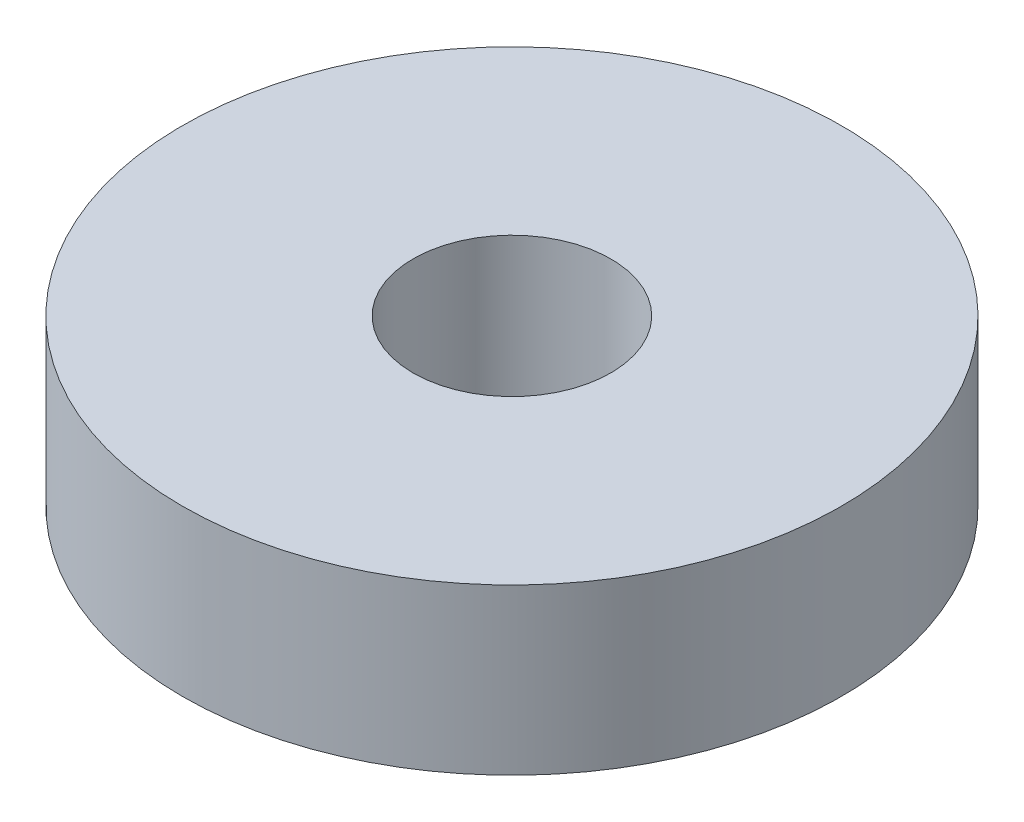
ISO-10303-21;
HEADER;
FILE_DESCRIPTION(('STEP AP214'),'2;1');
FILE_NAME('part.step','',(''),(''),'','','');
FILE_SCHEMA(('AUTOMOTIVE_DESIGN { 1 0 10303 214 1 1 1 1 }'));
ENDSEC;
DATA;
#1=APPLICATION_CONTEXT('core data for automotive mechanical design processes');
#2=APPLICATION_PROTOCOL_DEFINITION('international standard','automotive_design',2000,#1);
#3=PRODUCT_CONTEXT('',#1,'mechanical');
#4=PRODUCT('Part','Part','',(#3));
#5=PRODUCT_RELATED_PRODUCT_CATEGORY('part','',(#4));
#6=PRODUCT_DEFINITION_FORMATION('','',#4);
#7=PRODUCT_DEFINITION_CONTEXT('part definition',#1,'design');
#8=PRODUCT_DEFINITION('design','',#6,#7);
#9=PRODUCT_DEFINITION_SHAPE('','',#8);
#10=(LENGTH_UNIT() NAMED_UNIT(*) SI_UNIT(.MILLI.,.METRE.));
#11=(NAMED_UNIT(*) PLANE_ANGLE_UNIT() SI_UNIT($,.RADIAN.));
#12=(NAMED_UNIT(*) SI_UNIT($,.STERADIAN.) SOLID_ANGLE_UNIT());
#13=UNCERTAINTY_MEASURE_WITH_UNIT(LENGTH_MEASURE(1.E-05),#10,'distance_accuracy_value','');
#14=(GEOMETRIC_REPRESENTATION_CONTEXT(3) GLOBAL_UNCERTAINTY_ASSIGNED_CONTEXT((#13)) GLOBAL_UNIT_ASSIGNED_CONTEXT((#10,
#11,#12)) REPRESENTATION_CONTEXT('',''));
#15=CARTESIAN_POINT('',(0.,0.,0.));
#16=DIRECTION('',(0.,0.,1.));
#17=DIRECTION('',(1.,0.,0.));
#18=AXIS2_PLACEMENT_3D('',#15,#16,#17);
#19=CARTESIAN_POINT('',(0.,5.,0.));
#20=DIRECTION('',(0.,-1.,0.));
#21=DIRECTION('',(0.,0.,-1.));
#22=AXIS2_PLACEMENT_3D('',#19,#20,#21);
#23=CYLINDRICAL_SURFACE('',#22,10.);
#24=CARTESIAN_POINT('',(0.,5.,0.));
#25=DIRECTION('',(0.,1.,0.));
#26=DIRECTION('',(0.,0.,1.));
#27=AXIS2_PLACEMENT_3D('',#24,#25,#26);
#28=CIRCLE('',#27,10.);
#29=CARTESIAN_POINT('',(0.,5.,10.));
#30=VERTEX_POINT('',#29);
#31=EDGE_CURVE('E10',#30,#30,#28,.T.);
#32=ORIENTED_EDGE('',*,*,#31,.F.);
#33=EDGE_LOOP('',(#32));
#34=FACE_BOUND('',#33,.T.);
#35=CARTESIAN_POINT('',(0.,0.,0.));
#36=DIRECTION('',(0.,1.,0.));
#37=DIRECTION('',(0.,0.,1.));
#38=AXIS2_PLACEMENT_3D('',#35,#36,#37);
#39=CIRCLE('',#38,10.);
#40=CARTESIAN_POINT('',(0.,0.,10.));
#41=VERTEX_POINT('',#40);
#42=EDGE_CURVE('E34',#41,#41,#39,.T.);
#43=ORIENTED_EDGE('',*,*,#42,.T.);
#44=EDGE_LOOP('',(#43));
#45=FACE_BOUND('',#44,.T.);
#46=ADVANCED_FACE('F31',(#34,#45),#23,.T.);
#47=CARTESIAN_POINT('',(0.,5.,0.));
#48=DIRECTION('',(0.,1.,0.));
#49=DIRECTION('',(0.,0.,1.));
#50=AXIS2_PLACEMENT_3D('',#47,#48,#49);
#51=PLANE('',#50);
#52=CARTESIAN_POINT('',(0.,5.,0.));
#53=DIRECTION('',(0.,1.,0.));
#54=DIRECTION('',(0.,0.,1.));
#55=AXIS2_PLACEMENT_3D('',#52,#53,#54);
#56=CIRCLE('',#55,3.);
#57=CARTESIAN_POINT('',(0.,5.,3.));
#58=VERTEX_POINT('',#57);
#59=EDGE_CURVE('E43',#58,#58,#56,.T.);
#60=ORIENTED_EDGE('',*,*,#59,.F.);
#61=EDGE_LOOP('',(#60));
#62=FACE_BOUND('',#61,.T.);
#63=ORIENTED_EDGE('',*,*,#31,.T.);
#64=EDGE_LOOP('',(#63));
#65=FACE_BOUND('',#64,.T.);
#66=ADVANCED_FACE('F58',(#62,#65),#51,.T.);
#67=CARTESIAN_POINT('',(0.,0.,0.));
#68=DIRECTION('',(0.,1.,0.));
#69=DIRECTION('',(0.,0.,1.));
#70=AXIS2_PLACEMENT_3D('',#67,#68,#69);
#71=PLANE('',#70);
#72=CARTESIAN_POINT('',(0.,0.,0.));
#73=DIRECTION('',(0.,1.,0.));
#74=DIRECTION('',(0.,0.,1.));
#75=AXIS2_PLACEMENT_3D('',#72,#73,#74);
#76=CIRCLE('',#75,3.);
#77=CARTESIAN_POINT('',(0.,0.,3.));
#78=VERTEX_POINT('',#77);
#79=EDGE_CURVE('E41',#78,#78,#76,.T.);
#80=ORIENTED_EDGE('',*,*,#79,.T.);
#81=EDGE_LOOP('',(#80));
#82=FACE_BOUND('',#81,.T.);
#83=ORIENTED_EDGE('',*,*,#42,.F.);
#84=EDGE_LOOP('',(#83));
#85=FACE_BOUND('',#84,.T.);
#86=ADVANCED_FACE('F49',(#82,#85),#71,.F.);
#87=CARTESIAN_POINT('',(0.,0.,0.));
#88=DIRECTION('',(0.,1.,0.));
#89=DIRECTION('',(0.,0.,1.));
#90=AXIS2_PLACEMENT_3D('',#87,#88,#89);
#91=CYLINDRICAL_SURFACE('',#90,3.);
#92=ORIENTED_EDGE('',*,*,#79,.F.);
#93=EDGE_LOOP('',(#92));
#94=FACE_BOUND('',#93,.T.);
#95=ORIENTED_EDGE('',*,*,#59,.T.);
#96=EDGE_LOOP('',(#95));
#97=FACE_BOUND('',#96,.T.);
#98=ADVANCED_FACE('F52',(#94,#97),#91,.F.);
#99=CLOSED_SHELL('',(#46,#66,#86,#98));
#100=MANIFOLD_SOLID_BREP('B2',#99);
#101=ADVANCED_BREP_SHAPE_REPRESENTATION('',(#18,#100),#14);
#102=SHAPE_DEFINITION_REPRESENTATION(#9,#101);
ENDSEC;
END-ISO-10303-21;
